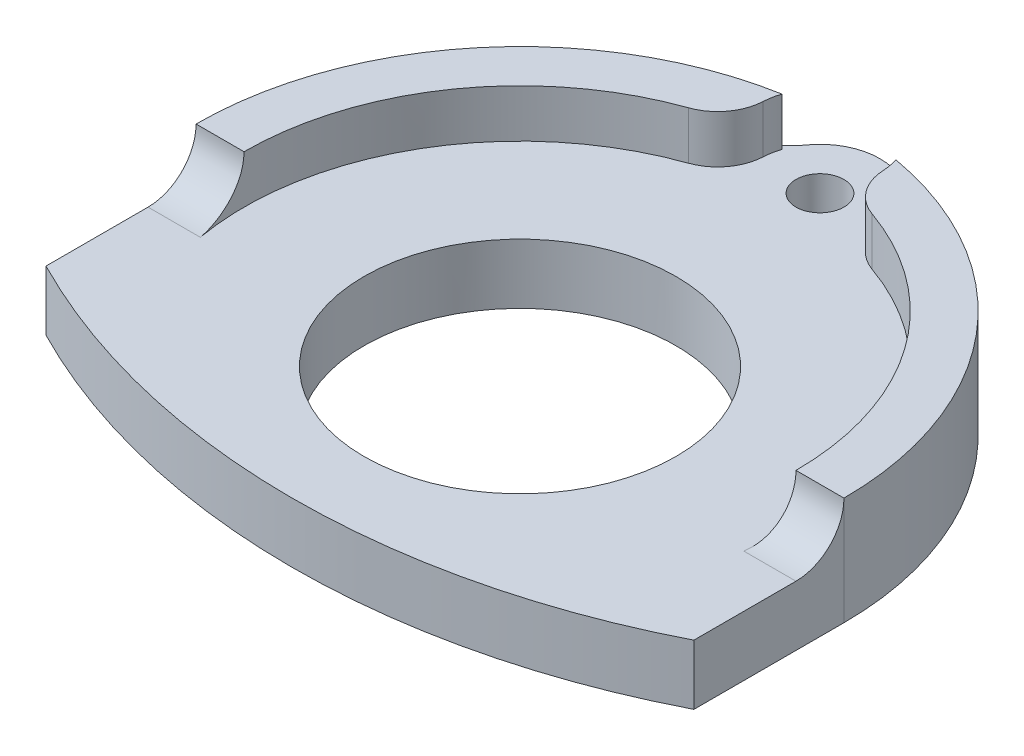
ISO-10303-21;
HEADER;
FILE_DESCRIPTION(('STEP AP214'),'2;1');
FILE_NAME('part.step','',(''),(''),'','','');
FILE_SCHEMA(('AUTOMOTIVE_DESIGN { 1 0 10303 214 1 1 1 1 }'));
ENDSEC;
DATA;
#1=APPLICATION_CONTEXT('core data for automotive mechanical design processes');
#2=APPLICATION_PROTOCOL_DEFINITION('international standard','automotive_design',2000,#1);
#3=PRODUCT_CONTEXT('',#1,'mechanical');
#4=PRODUCT('Part','Part','',(#3));
#5=PRODUCT_RELATED_PRODUCT_CATEGORY('part','',(#4));
#6=PRODUCT_DEFINITION_FORMATION('','',#4);
#7=PRODUCT_DEFINITION_CONTEXT('part definition',#1,'design');
#8=PRODUCT_DEFINITION('design','',#6,#7);
#9=PRODUCT_DEFINITION_SHAPE('','',#8);
#10=(LENGTH_UNIT() NAMED_UNIT(*) SI_UNIT(.MILLI.,.METRE.));
#11=(NAMED_UNIT(*) PLANE_ANGLE_UNIT() SI_UNIT($,.RADIAN.));
#12=(NAMED_UNIT(*) SI_UNIT($,.STERADIAN.) SOLID_ANGLE_UNIT());
#13=UNCERTAINTY_MEASURE_WITH_UNIT(LENGTH_MEASURE(1.E-05),#10,'distance_accuracy_value','');
#14=(GEOMETRIC_REPRESENTATION_CONTEXT(3) GLOBAL_UNCERTAINTY_ASSIGNED_CONTEXT((#13)) GLOBAL_UNIT_ASSIGNED_CONTEXT((#10,
#11,#12)) REPRESENTATION_CONTEXT('',''));
#15=CARTESIAN_POINT('',(0.,0.,0.));
#16=DIRECTION('',(0.,0.,1.));
#17=DIRECTION('',(1.,0.,0.));
#18=AXIS2_PLACEMENT_3D('',#15,#16,#17);
#19=CARTESIAN_POINT('',(0.,2.50000000000001,0.));
#20=DIRECTION('',(0.,-1.,0.));
#21=DIRECTION('',(0.,0.,-1.));
#22=AXIS2_PLACEMENT_3D('',#19,#20,#21);
#23=PLANE('',#22);
#24=CARTESIAN_POINT('',(0.,2.50000000000002,20.185));
#25=DIRECTION('',(0.,-1.,0.));
#26=DIRECTION('',(0.,0.,-1.));
#27=AXIS2_PLACEMENT_3D('',#24,#25,#26);
#28=CIRCLE('',#27,6.50000000000001);
#29=CARTESIAN_POINT('',(0.,2.50000000000001,13.685));
#30=VERTEX_POINT('',#29);
#31=EDGE_CURVE('E215',#30,#30,#28,.T.);
#32=ORIENTED_EDGE('',*,*,#31,.T.);
#33=EDGE_LOOP('',(#32));
#34=FACE_BOUND('',#33,.T.);
#35=CARTESIAN_POINT('',(0.,2.50000000000001,7.68500000000002));
#36=DIRECTION('',(0.,-1.,0.));
#37=DIRECTION('',(0.,0.,-1.));
#38=AXIS2_PLACEMENT_3D('',#35,#36,#37);
#39=CIRCLE('',#38,1.);
#40=CARTESIAN_POINT('',(0.,2.50000000000001,6.68500000000002));
#41=VERTEX_POINT('',#40);
#42=EDGE_CURVE('E237',#41,#41,#39,.T.);
#43=ORIENTED_EDGE('',*,*,#42,.T.);
#44=EDGE_LOOP('',(#43));
#45=FACE_BOUND('',#44,.T.);
#46=CARTESIAN_POINT('',(0.,2.50000000000002,20.185));
#47=DIRECTION('',(0.,-1.,0.));
#48=DIRECTION('',(0.,0.,1.));
#49=AXIS2_PLACEMENT_3D('',#46,#47,#48);
#50=CIRCLE('',#49,11.5);
#51=CARTESIAN_POINT('',(-11.3247516529061,2.50000000000002,22.1850000000001));
#52=VERTEX_POINT('',#51);
#53=CARTESIAN_POINT('',(-3.82832306316937,2.50000000000001,9.34092592592594));
#54=VERTEX_POINT('',#53);
#55=EDGE_CURVE('E193',#52,#54,#50,.T.);
#56=ORIENTED_EDGE('',*,*,#55,.F.);
#57=DIRECTION('',(1.,0.,0.));
#58=VECTOR('',#57,1.);
#59=CARTESIAN_POINT('',(-13.5000000000001,2.50000000000002,22.185));
#60=LINE('',#59,#58);
#61=CARTESIAN_POINT('',(-13.5,2.50000000000002,22.185));
#62=VERTEX_POINT('',#61);
#63=EDGE_CURVE('E282',#52,#62,#60,.F.);
#64=ORIENTED_EDGE('',*,*,#63,.T.);
#65=DIRECTION('',(0.,0.,-1.));
#66=VECTOR('',#65,1.);
#67=CARTESIAN_POINT('',(-13.5,2.50000000000002,26.4376478719269));
#68=LINE('',#67,#66);
#69=CARTESIAN_POINT('',(-13.5,2.50000000000002,26.4376478719269));
#70=VERTEX_POINT('',#69);
#71=EDGE_CURVE('E225',#70,#62,#68,.T.);
#72=ORIENTED_EDGE('',*,*,#71,.F.);
#73=CARTESIAN_POINT('',(0.,2.50000000000001,0.));
#74=DIRECTION('',(0.,-1.,0.));
#75=DIRECTION('',(0.,0.,-1.));
#76=AXIS2_PLACEMENT_3D('',#73,#74,#75);
#77=CIRCLE('',#76,29.685);
#78=CARTESIAN_POINT('',(13.5,2.50000000000002,26.4376478719269));
#79=VERTEX_POINT('',#78);
#80=EDGE_CURVE('E230',#79,#70,#77,.T.);
#81=ORIENTED_EDGE('',*,*,#80,.F.);
#82=DIRECTION('',(0.,0.,1.));
#83=VECTOR('',#82,1.);
#84=CARTESIAN_POINT('',(13.5,2.50000000000002,26.4376478719269));
#85=LINE('',#84,#83);
#86=CARTESIAN_POINT('',(13.5,2.50000000000002,22.185));
#87=VERTEX_POINT('',#86);
#88=EDGE_CURVE('E216',#87,#79,#85,.T.);
#89=ORIENTED_EDGE('',*,*,#88,.F.);
#90=DIRECTION('',(1.,0.,0.));
#91=VECTOR('',#90,1.);
#92=CARTESIAN_POINT('',(11.5,2.50000000000002,22.185));
#93=LINE('',#92,#91);
#94=CARTESIAN_POINT('',(11.3247516529061,2.50000000000002,22.185));
#95=VERTEX_POINT('',#94);
#96=EDGE_CURVE('E279',#87,#95,#93,.F.);
#97=ORIENTED_EDGE('',*,*,#96,.T.);
#98=CARTESIAN_POINT('',(0.,2.50000000000002,20.185));
#99=DIRECTION('',(0.,-1.,0.));
#100=DIRECTION('',(0.,0.,1.));
#101=AXIS2_PLACEMENT_3D('',#98,#99,#100);
#102=CIRCLE('',#101,11.5);
#103=CARTESIAN_POINT('',(3.82832306316937,2.50000000000001,9.34092592592595));
#104=VERTEX_POINT('',#103);
#105=EDGE_CURVE('E395',#104,#95,#102,.T.);
#106=ORIENTED_EDGE('',*,*,#105,.F.);
#107=CARTESIAN_POINT('',(4.49411837850317,2.50000000000001,7.45500000000002));
#108=DIRECTION('',(0.,1.,0.));
#109=DIRECTION('',(0.,0.,1.));
#110=AXIS2_PLACEMENT_3D('',#107,#108,#109);
#111=CIRCLE('',#110,2.);
#112=CARTESIAN_POINT('',(2.49673243250177,2.50000000000001,7.55722222222224));
#113=VERTEX_POINT('',#112);
#114=EDGE_CURVE('E176',#113,#104,#111,.T.);
#115=ORIENTED_EDGE('',*,*,#114,.F.);
#116=CARTESIAN_POINT('',(0.,2.50000000000001,7.68500000000002));
#117=DIRECTION('',(0.,-1.,0.));
#118=DIRECTION('',(0.,0.,1.));
#119=AXIS2_PLACEMENT_3D('',#116,#117,#118);
#120=CIRCLE('',#119,2.5);
#121=CARTESIAN_POINT('',(2.37189797419704,2.50000000000001,6.89500000000002));
#122=VERTEX_POINT('',#121);
#123=EDGE_CURVE('E172',#122,#113,#120,.T.);
#124=ORIENTED_EDGE('',*,*,#123,.F.);
#125=CARTESIAN_POINT('',(0.,2.50000000000002,20.185));
#126=DIRECTION('',(0.,-1.,0.));
#127=DIRECTION('',(0.,0.,-1.));
#128=AXIS2_PLACEMENT_3D('',#125,#126,#127);
#129=CIRCLE('',#128,13.5);
#130=CARTESIAN_POINT('',(3.22934120851282,2.50000000000001,7.07693548387099));
#131=VERTEX_POINT('',#130);
#132=EDGE_CURVE('E262',#131,#122,#129,.F.);
#133=ORIENTED_EDGE('',*,*,#132,.F.);
#134=CARTESIAN_POINT('',(3.70776212829249,2.50000000000001,5.13500000000002));
#135=DIRECTION('',(0.,-1.,0.));
#136=DIRECTION('',(0.,0.,-1.));
#137=AXIS2_PLACEMENT_3D('',#134,#135,#136);
#138=CIRCLE('',#137,2.);
#139=CARTESIAN_POINT('',(2.05986784905139,2.50000000000001,6.26833333333335));
#140=VERTEX_POINT('',#139);
#141=EDGE_CURVE('E284',#131,#140,#138,.T.);
#142=ORIENTED_EDGE('',*,*,#141,.T.);
#143=CARTESIAN_POINT('',(0.,2.50000000000001,7.68500000000002));
#144=DIRECTION('',(0.,-1.,0.));
#145=DIRECTION('',(0.,0.,-1.));
#146=AXIS2_PLACEMENT_3D('',#143,#144,#145);
#147=CIRCLE('',#146,2.5);
#148=CARTESIAN_POINT('',(-2.05986784905139,2.50000000000001,6.26833333333335));
#149=VERTEX_POINT('',#148);
#150=EDGE_CURVE('E220',#149,#140,#147,.T.);
#151=ORIENTED_EDGE('',*,*,#150,.F.);
#152=CARTESIAN_POINT('',(-3.70776212829249,2.50000000000001,5.13500000000002));
#153=DIRECTION('',(0.,-1.,0.));
#154=DIRECTION('',(0.,0.,-1.));
#155=AXIS2_PLACEMENT_3D('',#152,#153,#154);
#156=CIRCLE('',#155,2.);
#157=CARTESIAN_POINT('',(-3.22934120851282,2.50000000000001,7.07693548387099));
#158=VERTEX_POINT('',#157);
#159=EDGE_CURVE('E288',#149,#158,#156,.T.);
#160=ORIENTED_EDGE('',*,*,#159,.T.);
#161=CARTESIAN_POINT('',(0.,2.50000000000002,20.185));
#162=DIRECTION('',(0.,-1.,0.));
#163=DIRECTION('',(0.,0.,-1.));
#164=AXIS2_PLACEMENT_3D('',#161,#162,#163);
#165=CIRCLE('',#164,13.5);
#166=CARTESIAN_POINT('',(-2.37189797419704,2.50000000000001,6.89500000000002));
#167=VERTEX_POINT('',#166);
#168=EDGE_CURVE('E276',#167,#158,#165,.F.);
#169=ORIENTED_EDGE('',*,*,#168,.F.);
#170=CARTESIAN_POINT('',(0.,2.50000000000001,7.68500000000002));
#171=DIRECTION('',(0.,-1.,0.));
#172=DIRECTION('',(0.,0.,1.));
#173=AXIS2_PLACEMENT_3D('',#170,#171,#172);
#174=CIRCLE('',#173,2.5);
#175=CARTESIAN_POINT('',(-2.49673243250177,2.50000000000001,7.55722222222224));
#176=VERTEX_POINT('',#175);
#177=EDGE_CURVE('E182',#176,#167,#174,.T.);
#178=ORIENTED_EDGE('',*,*,#177,.F.);
#179=CARTESIAN_POINT('',(-4.49411837850317,2.50000000000001,7.45500000000002));
#180=DIRECTION('',(0.,1.,0.));
#181=DIRECTION('',(0.,0.,1.));
#182=AXIS2_PLACEMENT_3D('',#179,#180,#181);
#183=CIRCLE('',#182,2.);
#184=EDGE_CURVE('E178',#54,#176,#183,.T.);
#185=ORIENTED_EDGE('',*,*,#184,.F.);
#186=EDGE_LOOP('',(#56,#64,#72,#81,#89,#97,#106,#115,#124,#133,#142,#151,#160,#169,#178,#185));
#187=FACE_BOUND('',#186,.T.);
#188=ADVANCED_FACE('F33',(#34,#45,#187),#23,.F.);
#189=CARTESIAN_POINT('',(0.,-36.4588809482683,0.));
#190=DIRECTION('',(0.,1.,0.));
#191=DIRECTION('',(0.,0.,1.));
#192=AXIS2_PLACEMENT_3D('',#189,#190,#191);
#193=CYLINDRICAL_SURFACE('',#192,29.685);
#194=DIRECTION('',(0.,1.,0.));
#195=VECTOR('',#194,1.);
#196=CARTESIAN_POINT('',(-13.5,-36.4588809482683,26.4376478719269));
#197=LINE('',#196,#195);
#198=CARTESIAN_POINT('',(-13.5,0.,26.4376478719269));
#199=VERTEX_POINT('',#198);
#200=EDGE_CURVE('E229',#199,#70,#197,.T.);
#201=ORIENTED_EDGE('',*,*,#200,.F.);
#202=CARTESIAN_POINT('',(0.,0.,0.));
#203=DIRECTION('',(0.,1.,0.));
#204=DIRECTION('',(0.,0.,1.));
#205=AXIS2_PLACEMENT_3D('',#202,#203,#204);
#206=CIRCLE('',#205,29.685);
#207=CARTESIAN_POINT('',(13.5,0.,26.4376478719269));
#208=VERTEX_POINT('',#207);
#209=EDGE_CURVE('E240',#199,#208,#206,.T.);
#210=ORIENTED_EDGE('',*,*,#209,.T.);
#211=DIRECTION('',(0.,1.,0.));
#212=VECTOR('',#211,1.);
#213=CARTESIAN_POINT('',(13.5,-36.4588809482683,26.4376478719269));
#214=LINE('',#213,#212);
#215=EDGE_CURVE('E234',#208,#79,#214,.T.);
#216=ORIENTED_EDGE('',*,*,#215,.T.);
#217=ORIENTED_EDGE('',*,*,#80,.T.);
#218=EDGE_LOOP('',(#201,#210,#216,#217));
#219=FACE_BOUND('',#218,.T.);
#220=ADVANCED_FACE('F332',(#219),#193,.T.);
#221=CARTESIAN_POINT('',(-13.5,-36.4588809482683,26.4376478719269));
#222=DIRECTION('',(1.,0.,0.));
#223=DIRECTION('',(0.,0.,-1.));
#224=AXIS2_PLACEMENT_3D('',#221,#222,#223);
#225=PLANE('',#224);
#226=DIRECTION('',(0.,1.,0.));
#227=VECTOR('',#226,1.);
#228=CARTESIAN_POINT('',(-13.5,-36.4588809482683,20.185));
#229=LINE('',#228,#227);
#230=CARTESIAN_POINT('',(-13.5,0.,20.185));
#231=VERTEX_POINT('',#230);
#232=CARTESIAN_POINT('',(-13.5,4.50000000000002,20.185));
#233=VERTEX_POINT('',#232);
#234=EDGE_CURVE('E55',#231,#233,#229,.T.);
#235=ORIENTED_EDGE('',*,*,#234,.F.);
#236=DIRECTION('',(0.,0.,1.));
#237=VECTOR('',#236,1.);
#238=CARTESIAN_POINT('',(-13.5,0.,26.4376478719269));
#239=LINE('',#238,#237);
#240=EDGE_CURVE('E233',#231,#199,#239,.T.);
#241=ORIENTED_EDGE('',*,*,#240,.T.);
#242=ORIENTED_EDGE('',*,*,#200,.T.);
#243=ORIENTED_EDGE('',*,*,#71,.T.);
#244=CARTESIAN_POINT('',(-13.5,4.50000000000002,22.185));
#245=DIRECTION('',(1.,0.,0.));
#246=DIRECTION('',(0.,0.,-1.));
#247=AXIS2_PLACEMENT_3D('',#244,#245,#246);
#248=CIRCLE('',#247,2.);
#249=EDGE_CURVE('E300',#62,#233,#248,.T.);
#250=ORIENTED_EDGE('',*,*,#249,.T.);
#251=EDGE_LOOP('',(#235,#241,#242,#243,#250));
#252=FACE_BOUND('',#251,.T.);
#253=ADVANCED_FACE('F335',(#252),#225,.F.);
#254=CARTESIAN_POINT('',(0.,-36.4588809482683,20.185));
#255=DIRECTION('',(0.,1.,0.));
#256=DIRECTION('',(0.,0.,1.));
#257=AXIS2_PLACEMENT_3D('',#254,#255,#256);
#258=CYLINDRICAL_SURFACE('',#257,13.5);
#259=DIRECTION('',(0.,-1.,0.));
#260=VECTOR('',#259,1.);
#261=CARTESIAN_POINT('',(-2.37189797419704,4.50000000000001,6.89500000000002));
#262=LINE('',#261,#260);
#263=CARTESIAN_POINT('',(-2.37189797419704,4.50000000000001,6.89500000000002));
#264=VERTEX_POINT('',#263);
#265=EDGE_CURVE('E209',#264,#167,#262,.T.);
#266=ORIENTED_EDGE('',*,*,#265,.T.);
#267=ORIENTED_EDGE('',*,*,#168,.T.);
#268=DIRECTION('',(0.,1.,0.));
#269=VECTOR('',#268,1.);
#270=CARTESIAN_POINT('',(-3.22934120851282,-36.4588809482683,7.07693548387101));
#271=LINE('',#270,#269);
#272=CARTESIAN_POINT('',(-3.22934120851282,0.,7.07693548387099));
#273=VERTEX_POINT('',#272);
#274=EDGE_CURVE('E274',#158,#273,#271,.F.);
#275=ORIENTED_EDGE('',*,*,#274,.T.);
#276=CARTESIAN_POINT('',(0.,0.,20.185));
#277=DIRECTION('',(0.,1.,0.));
#278=DIRECTION('',(0.,0.,1.));
#279=AXIS2_PLACEMENT_3D('',#276,#277,#278);
#280=CIRCLE('',#279,13.5);
#281=EDGE_CURVE('E228',#273,#231,#280,.T.);
#282=ORIENTED_EDGE('',*,*,#281,.T.);
#283=ORIENTED_EDGE('',*,*,#234,.T.);
#284=CARTESIAN_POINT('',(0.,4.50000000000002,20.185));
#285=DIRECTION('',(0.,1.,0.));
#286=DIRECTION('',(0.,0.,1.));
#287=AXIS2_PLACEMENT_3D('',#284,#285,#286);
#288=CIRCLE('',#287,13.5);
#289=EDGE_CURVE('E195',#264,#233,#288,.T.);
#290=ORIENTED_EDGE('',*,*,#289,.F.);
#291=EDGE_LOOP('',(#266,#267,#275,#282,#283,#290));
#292=FACE_BOUND('',#291,.T.);
#293=ADVANCED_FACE('F339',(#292),#258,.T.);
#294=CARTESIAN_POINT('',(0.,-36.4588809482683,7.68500000000004));
#295=DIRECTION('',(0.,1.,0.));
#296=DIRECTION('',(0.,0.,1.));
#297=AXIS2_PLACEMENT_3D('',#294,#295,#296);
#298=CYLINDRICAL_SURFACE('',#297,2.5);
#299=ORIENTED_EDGE('',*,*,#150,.T.);
#300=DIRECTION('',(0.,1.,0.));
#301=VECTOR('',#300,1.);
#302=CARTESIAN_POINT('',(2.05986784905139,-36.4588809482683,6.26833333333337));
#303=LINE('',#302,#301);
#304=CARTESIAN_POINT('',(2.05986784905139,0.,6.26833333333335));
#305=VERTEX_POINT('',#304);
#306=EDGE_CURVE('E272',#140,#305,#303,.F.);
#307=ORIENTED_EDGE('',*,*,#306,.T.);
#308=CARTESIAN_POINT('',(0.,0.,7.68500000000002));
#309=DIRECTION('',(0.,1.,0.));
#310=DIRECTION('',(0.,0.,1.));
#311=AXIS2_PLACEMENT_3D('',#308,#309,#310);
#312=CIRCLE('',#311,2.5);
#313=CARTESIAN_POINT('',(-2.05986784905139,0.,6.26833333333335));
#314=VERTEX_POINT('',#313);
#315=EDGE_CURVE('E224',#305,#314,#312,.T.);
#316=ORIENTED_EDGE('',*,*,#315,.T.);
#317=DIRECTION('',(0.,1.,0.));
#318=VECTOR('',#317,1.);
#319=CARTESIAN_POINT('',(-2.05986784905139,-36.4588809482683,6.26833333333337));
#320=LINE('',#319,#318);
#321=EDGE_CURVE('E269',#314,#149,#320,.T.);
#322=ORIENTED_EDGE('',*,*,#321,.T.);
#323=EDGE_LOOP('',(#299,#307,#316,#322));
#324=FACE_BOUND('',#323,.T.);
#325=ADVANCED_FACE('F343',(#324),#298,.T.);
#326=CARTESIAN_POINT('',(0.,-36.4588809482683,20.185));
#327=DIRECTION('',(0.,1.,0.));
#328=DIRECTION('',(0.,0.,1.));
#329=AXIS2_PLACEMENT_3D('',#326,#327,#328);
#330=CYLINDRICAL_SURFACE('',#329,13.5);
#331=CARTESIAN_POINT('',(0.,0.,20.185));
#332=DIRECTION('',(0.,1.,0.));
#333=DIRECTION('',(0.,0.,1.));
#334=AXIS2_PLACEMENT_3D('',#331,#332,#333);
#335=CIRCLE('',#334,13.5);
#336=CARTESIAN_POINT('',(13.5,0.,20.185));
#337=VERTEX_POINT('',#336);
#338=CARTESIAN_POINT('',(3.22934120851282,0.,7.07693548387099));
#339=VERTEX_POINT('',#338);
#340=EDGE_CURVE('E223',#337,#339,#335,.T.);
#341=ORIENTED_EDGE('',*,*,#340,.T.);
#342=DIRECTION('',(0.,1.,0.));
#343=VECTOR('',#342,1.);
#344=CARTESIAN_POINT('',(3.22934120851282,-36.4588809482683,7.07693548387101));
#345=LINE('',#344,#343);
#346=EDGE_CURVE('E266',#339,#131,#345,.T.);
#347=ORIENTED_EDGE('',*,*,#346,.T.);
#348=ORIENTED_EDGE('',*,*,#132,.T.);
#349=DIRECTION('',(0.,-1.,0.));
#350=VECTOR('',#349,1.);
#351=CARTESIAN_POINT('',(2.37189797419704,4.50000000000001,6.89500000000002));
#352=LINE('',#351,#350);
#353=CARTESIAN_POINT('',(2.37189797419704,4.50000000000001,6.89500000000002));
#354=VERTEX_POINT('',#353);
#355=EDGE_CURVE('E179',#354,#122,#352,.T.);
#356=ORIENTED_EDGE('',*,*,#355,.F.);
#357=CARTESIAN_POINT('',(0.,4.50000000000002,20.185));
#358=DIRECTION('',(0.,1.,0.));
#359=DIRECTION('',(0.,0.,1.));
#360=AXIS2_PLACEMENT_3D('',#357,#358,#359);
#361=CIRCLE('',#360,13.5);
#362=CARTESIAN_POINT('',(13.5,4.50000000000002,20.185));
#363=VERTEX_POINT('',#362);
#364=EDGE_CURVE('E389',#363,#354,#361,.T.);
#365=ORIENTED_EDGE('',*,*,#364,.F.);
#366=DIRECTION('',(0.,1.,0.));
#367=VECTOR('',#366,1.);
#368=CARTESIAN_POINT('',(13.5,-36.4588809482683,20.185));
#369=LINE('',#368,#367);
#370=EDGE_CURVE('E219',#337,#363,#369,.T.);
#371=ORIENTED_EDGE('',*,*,#370,.F.);
#372=EDGE_LOOP('',(#341,#347,#348,#356,#365,#371));
#373=FACE_BOUND('',#372,.T.);
#374=ADVANCED_FACE('F346',(#373),#330,.T.);
#375=CARTESIAN_POINT('',(13.5,-36.4588809482683,26.4376478719269));
#376=DIRECTION('',(-1.,0.,0.));
#377=DIRECTION('',(0.,0.,1.));
#378=AXIS2_PLACEMENT_3D('',#375,#376,#377);
#379=PLANE('',#378);
#380=ORIENTED_EDGE('',*,*,#215,.F.);
#381=DIRECTION('',(0.,0.,-1.));
#382=VECTOR('',#381,1.);
#383=CARTESIAN_POINT('',(13.5,0.,26.4376478719269));
#384=LINE('',#383,#382);
#385=EDGE_CURVE('E245',#208,#337,#384,.T.);
#386=ORIENTED_EDGE('',*,*,#385,.T.);
#387=ORIENTED_EDGE('',*,*,#370,.T.);
#388=CARTESIAN_POINT('',(13.5,4.50000000000002,22.185));
#389=DIRECTION('',(-1.,0.,0.));
#390=DIRECTION('',(0.,0.,1.));
#391=AXIS2_PLACEMENT_3D('',#388,#389,#390);
#392=CIRCLE('',#391,2.);
#393=EDGE_CURVE('E48',#363,#87,#392,.T.);
#394=ORIENTED_EDGE('',*,*,#393,.T.);
#395=ORIENTED_EDGE('',*,*,#88,.T.);
#396=EDGE_LOOP('',(#380,#386,#387,#394,#395));
#397=FACE_BOUND('',#396,.T.);
#398=ADVANCED_FACE('F330',(#397),#379,.F.);
#399=CARTESIAN_POINT('',(0.,-36.4588809482683,20.185));
#400=DIRECTION('',(0.,1.,0.));
#401=DIRECTION('',(0.,0.,1.));
#402=AXIS2_PLACEMENT_3D('',#399,#400,#401);
#403=CYLINDRICAL_SURFACE('',#402,6.50000000000001);
#404=CARTESIAN_POINT('',(0.,0.,20.185));
#405=DIRECTION('',(0.,1.,0.));
#406=DIRECTION('',(0.,0.,1.));
#407=AXIS2_PLACEMENT_3D('',#404,#405,#406);
#408=CIRCLE('',#407,6.50000000000001);
#409=CARTESIAN_POINT('',(0.,0.,26.685));
#410=VERTEX_POINT('',#409);
#411=EDGE_CURVE('E259',#410,#410,#408,.T.);
#412=ORIENTED_EDGE('',*,*,#411,.F.);
#413=EDGE_LOOP('',(#412));
#414=FACE_BOUND('',#413,.T.);
#415=ORIENTED_EDGE('',*,*,#31,.F.);
#416=EDGE_LOOP('',(#415));
#417=FACE_BOUND('',#416,.T.);
#418=ADVANCED_FACE('F326',(#414,#417),#403,.F.);
#419=CARTESIAN_POINT('',(0.,-36.4588809482683,7.68500000000004));
#420=DIRECTION('',(0.,1.,0.));
#421=DIRECTION('',(0.,0.,1.));
#422=AXIS2_PLACEMENT_3D('',#419,#420,#421);
#423=CYLINDRICAL_SURFACE('',#422,1.);
#424=CARTESIAN_POINT('',(0.,0.,7.68500000000002));
#425=DIRECTION('',(0.,1.,0.));
#426=DIRECTION('',(0.,0.,1.));
#427=AXIS2_PLACEMENT_3D('',#424,#425,#426);
#428=CIRCLE('',#427,1.);
#429=CARTESIAN_POINT('',(0.,0.,8.68500000000002));
#430=VERTEX_POINT('',#429);
#431=EDGE_CURVE('E218',#430,#430,#428,.T.);
#432=ORIENTED_EDGE('',*,*,#431,.F.);
#433=EDGE_LOOP('',(#432));
#434=FACE_BOUND('',#433,.T.);
#435=ORIENTED_EDGE('',*,*,#42,.F.);
#436=EDGE_LOOP('',(#435));
#437=FACE_BOUND('',#436,.T.);
#438=ADVANCED_FACE('F322',(#434,#437),#423,.F.);
#439=CARTESIAN_POINT('',(0.,0.,0.));
#440=DIRECTION('',(0.,1.,0.));
#441=DIRECTION('',(0.,0.,1.));
#442=AXIS2_PLACEMENT_3D('',#439,#440,#441);
#443=PLANE('',#442);
#444=ORIENTED_EDGE('',*,*,#431,.T.);
#445=EDGE_LOOP('',(#444));
#446=FACE_BOUND('',#445,.T.);
#447=ORIENTED_EDGE('',*,*,#411,.T.);
#448=EDGE_LOOP('',(#447));
#449=FACE_BOUND('',#448,.T.);
#450=ORIENTED_EDGE('',*,*,#240,.F.);
#451=ORIENTED_EDGE('',*,*,#281,.F.);
#452=CARTESIAN_POINT('',(-3.70776212829249,0.,5.13500000000002));
#453=DIRECTION('',(0.,1.,0.));
#454=DIRECTION('',(0.,0.,1.));
#455=AXIS2_PLACEMENT_3D('',#452,#453,#454);
#456=CIRCLE('',#455,2.);
#457=EDGE_CURVE('E290',#273,#314,#456,.T.);
#458=ORIENTED_EDGE('',*,*,#457,.T.);
#459=ORIENTED_EDGE('',*,*,#315,.F.);
#460=CARTESIAN_POINT('',(3.70776212829249,0.,5.13500000000002));
#461=DIRECTION('',(0.,1.,0.));
#462=DIRECTION('',(0.,0.,1.));
#463=AXIS2_PLACEMENT_3D('',#460,#461,#462);
#464=CIRCLE('',#463,2.);
#465=EDGE_CURVE('E286',#305,#339,#464,.T.);
#466=ORIENTED_EDGE('',*,*,#465,.T.);
#467=ORIENTED_EDGE('',*,*,#340,.F.);
#468=ORIENTED_EDGE('',*,*,#385,.F.);
#469=ORIENTED_EDGE('',*,*,#209,.F.);
#470=EDGE_LOOP('',(#450,#451,#458,#459,#466,#467,#468,#469));
#471=FACE_BOUND('',#470,.T.);
#472=ADVANCED_FACE('F318',(#446,#449,#471),#443,.F.);
#473=CARTESIAN_POINT('',(-4.49411837850317,4.50000000000001,7.45500000000002));
#474=DIRECTION('',(0.,-1.,0.));
#475=DIRECTION('',(0.,0.,-1.));
#476=AXIS2_PLACEMENT_3D('',#473,#474,#475);
#477=CYLINDRICAL_SURFACE('',#476,2.);
#478=ORIENTED_EDGE('',*,*,#184,.T.);
#479=DIRECTION('',(0.,-1.,0.));
#480=VECTOR('',#479,1.);
#481=CARTESIAN_POINT('',(-2.49673243250177,4.50000000000001,7.55722222222224));
#482=LINE('',#481,#480);
#483=CARTESIAN_POINT('',(-2.49673243250177,4.50000000000001,7.55722222222224));
#484=VERTEX_POINT('',#483);
#485=EDGE_CURVE('E212',#484,#176,#482,.T.);
#486=ORIENTED_EDGE('',*,*,#485,.F.);
#487=CARTESIAN_POINT('',(-4.49411837850317,4.50000000000001,7.45500000000002));
#488=DIRECTION('',(0.,1.,0.));
#489=DIRECTION('',(0.,0.,1.));
#490=AXIS2_PLACEMENT_3D('',#487,#488,#489);
#491=CIRCLE('',#490,2.);
#492=CARTESIAN_POINT('',(-3.82832306316937,4.50000000000001,9.34092592592594));
#493=VERTEX_POINT('',#492);
#494=EDGE_CURVE('E189',#493,#484,#491,.T.);
#495=ORIENTED_EDGE('',*,*,#494,.F.);
#496=DIRECTION('',(0.,-1.,0.));
#497=VECTOR('',#496,1.);
#498=CARTESIAN_POINT('',(-3.82832306316937,4.50000000000001,9.34092592592594));
#499=LINE('',#498,#497);
#500=EDGE_CURVE('E201',#493,#54,#499,.T.);
#501=ORIENTED_EDGE('',*,*,#500,.T.);
#502=EDGE_LOOP('',(#478,#486,#495,#501));
#503=FACE_BOUND('',#502,.T.);
#504=ADVANCED_FACE('F321',(#503),#477,.T.);
#505=CARTESIAN_POINT('',(0.,4.50000000000001,7.68500000000002));
#506=DIRECTION('',(0.,-1.,0.));
#507=DIRECTION('',(0.,0.,-1.));
#508=AXIS2_PLACEMENT_3D('',#505,#506,#507);
#509=CYLINDRICAL_SURFACE('',#508,2.5);
#510=ORIENTED_EDGE('',*,*,#177,.T.);
#511=ORIENTED_EDGE('',*,*,#265,.F.);
#512=CARTESIAN_POINT('',(0.,4.50000000000001,7.68500000000002));
#513=DIRECTION('',(0.,-1.,0.));
#514=DIRECTION('',(0.,0.,1.));
#515=AXIS2_PLACEMENT_3D('',#512,#513,#514);
#516=CIRCLE('',#515,2.5);
#517=EDGE_CURVE('E192',#484,#264,#516,.T.);
#518=ORIENTED_EDGE('',*,*,#517,.F.);
#519=ORIENTED_EDGE('',*,*,#485,.T.);
#520=EDGE_LOOP('',(#510,#511,#518,#519));
#521=FACE_BOUND('',#520,.T.);
#522=ADVANCED_FACE('F358',(#521),#509,.F.);
#523=CARTESIAN_POINT('',(0.,4.50000000000002,20.185));
#524=DIRECTION('',(0.,-1.,0.));
#525=DIRECTION('',(0.,0.,-1.));
#526=AXIS2_PLACEMENT_3D('',#523,#524,#525);
#527=CYLINDRICAL_SURFACE('',#526,11.5);
#528=ORIENTED_EDGE('',*,*,#55,.T.);
#529=ORIENTED_EDGE('',*,*,#500,.F.);
#530=CARTESIAN_POINT('',(0.,4.50000000000002,20.185));
#531=DIRECTION('',(0.,-1.,0.));
#532=DIRECTION('',(0.,0.,1.));
#533=AXIS2_PLACEMENT_3D('',#530,#531,#532);
#534=CIRCLE('',#533,11.5);
#535=CARTESIAN_POINT('',(-11.5,4.50000000000002,20.1850000000001));
#536=VERTEX_POINT('',#535);
#537=EDGE_CURVE('E200',#536,#493,#534,.T.);
#538=ORIENTED_EDGE('',*,*,#537,.F.);
#539=CARTESIAN_POINT('',(-11.5,4.50000000000002,20.1850000000001));
#540=CARTESIAN_POINT('',(-11.4999976236755,4.44374733309184,20.1850003763513));
#541=CARTESIAN_POINT('',(-11.5000002671938,4.38752161076206,20.1873747605939));
#542=CARTESIAN_POINT('',(-11.4999953359062,4.27547219969168,20.1968471688284));
#543=CARTESIAN_POINT('',(-11.4999877615774,4.21964849230176,20.2039449722573));
#544=CARTESIAN_POINT('',(-11.4999194022778,4.05347174240441,20.2322571148869));
#545=CARTESIAN_POINT('',(-11.4998131026205,3.94423123685088,20.2604903665561));
#546=CARTESIAN_POINT('',(-11.4990825919171,3.73204102943312,20.334891121923));
#547=CARTESIAN_POINT('',(-11.4984581235037,3.62909448097634,20.3810675316752));
#548=CARTESIAN_POINT('',(-11.4960824580623,3.43242301700089,20.490034700092));
#549=CARTESIAN_POINT('',(-11.4943314543284,3.33869652265971,20.5528226074215));
#550=CARTESIAN_POINT('',(-11.4889827068319,3.16325488953125,20.6931170112498));
#551=CARTESIAN_POINT('',(-11.4853873158656,3.081524618162,20.7706046768014));
#552=CARTESIAN_POINT('',(-11.4756203669828,2.93225717149507,20.9380984965053));
#553=CARTESIAN_POINT('',(-11.4694486310034,2.86472097769983,21.0281055156402));
#554=CARTESIAN_POINT('',(-11.4539512885931,2.7460656058967,21.2174574543701));
#555=CARTESIAN_POINT('',(-11.4446419638078,2.69486427986544,21.316752293595));
#556=CARTESIAN_POINT('',(-11.422466727138,2.60977998355569,21.5221219798795));
#557=CARTESIAN_POINT('',(-11.4096021603553,2.57589047725225,21.6281942510978));
#558=CARTESIAN_POINT('',(-11.3848716397311,2.53402776374608,21.8098885220371));
#559=CARTESIAN_POINT('',(-11.3739680647772,2.52125331619938,21.884575005238));
#560=CARTESIAN_POINT('',(-11.3505504425739,2.5042394277807,22.034545791612));
#561=CARTESIAN_POINT('',(-11.3380389031113,2.49998686398976,22.1098289961092));
#562=CARTESIAN_POINT('',(-11.3247516529061,2.50000000000002,22.1850000000001));
#563=B_SPLINE_CURVE_WITH_KNOTS('',3,(#539,#540,#541,#542,#543,#544,#545,#546,#547,#548,#549,
#550,#551,#552,#553,#554,#555,#556,#557,#558,#559,#560,#561,#562),.UNSPECIFIED.,.F.,.F.,(4,2,2,
2,2,2,2,2,2,2,2,4),(0.,0.168654383720686,0.337300892571235,0.674055343452161,1.01097715575047,
1.34784117347518,1.68427653462033,2.0207351521947,2.35547402584557,2.69008642627285,
2.9192744825752,3.14810933826064),.UNSPECIFIED.);
#564=EDGE_CURVE('E292',#536,#52,#563,.T.);
#565=ORIENTED_EDGE('',*,*,#564,.T.);
#566=EDGE_LOOP('',(#528,#529,#538,#565));
#567=FACE_BOUND('',#566,.T.);
#568=ADVANCED_FACE('F301',(#567),#527,.F.);
#569=CARTESIAN_POINT('',(-4.49411837850317,4.50000000000001,7.45500000000002));
#570=DIRECTION('',(0.,1.,0.));
#571=DIRECTION('',(0.,0.,1.));
#572=AXIS2_PLACEMENT_3D('',#569,#570,#571);
#573=PLANE('',#572);
#574=ORIENTED_EDGE('',*,*,#494,.T.);
#575=ORIENTED_EDGE('',*,*,#517,.T.);
#576=ORIENTED_EDGE('',*,*,#289,.T.);
#577=DIRECTION('',(1.,0.,0.));
#578=VECTOR('',#577,1.);
#579=CARTESIAN_POINT('',(-13.5,4.50000000000002,20.185));
#580=LINE('',#579,#578);
#581=EDGE_CURVE('E197',#233,#536,#580,.T.);
#582=ORIENTED_EDGE('',*,*,#581,.T.);
#583=ORIENTED_EDGE('',*,*,#537,.T.);
#584=EDGE_LOOP('',(#574,#575,#576,#582,#583));
#585=FACE_BOUND('',#584,.T.);
#586=ADVANCED_FACE('F365',(#585),#573,.T.);
#587=CARTESIAN_POINT('',(4.49411837850317,4.50000000000001,7.45500000000002));
#588=DIRECTION('',(0.,-1.,0.));
#589=DIRECTION('',(0.,0.,-1.));
#590=AXIS2_PLACEMENT_3D('',#587,#588,#589);
#591=CYLINDRICAL_SURFACE('',#590,2.);
#592=ORIENTED_EDGE('',*,*,#114,.T.);
#593=DIRECTION('',(0.,-1.,0.));
#594=VECTOR('',#593,1.);
#595=CARTESIAN_POINT('',(3.82832306316937,4.50000000000001,9.34092592592594));
#596=LINE('',#595,#594);
#597=CARTESIAN_POINT('',(3.82832306316937,4.50000000000001,9.34092592592594));
#598=VERTEX_POINT('',#597);
#599=EDGE_CURVE('E156',#598,#104,#596,.T.);
#600=ORIENTED_EDGE('',*,*,#599,.F.);
#601=CARTESIAN_POINT('',(4.49411837850317,4.50000000000001,7.45500000000002));
#602=DIRECTION('',(0.,1.,0.));
#603=DIRECTION('',(0.,0.,1.));
#604=AXIS2_PLACEMENT_3D('',#601,#602,#603);
#605=CIRCLE('',#604,2.);
#606=CARTESIAN_POINT('',(2.49673243250177,4.50000000000001,7.55722222222224));
#607=VERTEX_POINT('',#606);
#608=EDGE_CURVE('E163',#607,#598,#605,.T.);
#609=ORIENTED_EDGE('',*,*,#608,.F.);
#610=DIRECTION('',(0.,-1.,0.));
#611=VECTOR('',#610,1.);
#612=CARTESIAN_POINT('',(2.49673243250177,4.50000000000001,7.55722222222224));
#613=LINE('',#612,#611);
#614=EDGE_CURVE('E185',#607,#113,#613,.T.);
#615=ORIENTED_EDGE('',*,*,#614,.T.);
#616=EDGE_LOOP('',(#592,#600,#609,#615));
#617=FACE_BOUND('',#616,.T.);
#618=ADVANCED_FACE('F174',(#617),#591,.T.);
#619=CARTESIAN_POINT('',(0.,4.50000000000002,20.185));
#620=DIRECTION('',(0.,-1.,0.));
#621=DIRECTION('',(0.,0.,-1.));
#622=AXIS2_PLACEMENT_3D('',#619,#620,#621);
#623=CYLINDRICAL_SURFACE('',#622,11.5);
#624=ORIENTED_EDGE('',*,*,#105,.T.);
#625=CARTESIAN_POINT('',(11.3247516529061,2.50000000000002,22.185));
#626=CARTESIAN_POINT('',(11.3345256876722,2.50000034861686,22.1296682330991));
#627=CARTESIAN_POINT('',(11.3438851500825,2.50229784388866,22.074288020873));
#628=CARTESIAN_POINT('',(11.3617387671699,2.51149921610737,21.9637690299018));
#629=CARTESIAN_POINT('',(11.3702328793566,2.51840331912261,21.9086302631393));
#630=CARTESIAN_POINT('',(11.3943382751175,2.54601666335144,21.7442506303362));
#631=CARTESIAN_POINT('',(11.4086011241677,2.5736268907632,21.6358842616591));
#632=CARTESIAN_POINT('',(11.4334645426677,2.64671490964463,21.4248472644601));
#633=CARTESIAN_POINT('',(11.4440616006098,2.69220974439487,21.3221821758392));
#634=CARTESIAN_POINT('',(11.4618847040925,2.79987201123031,21.1257071100697));
#635=CARTESIAN_POINT('',(11.4691118651983,2.86203391512809,21.0318942107213));
#636=CARTESIAN_POINT('',(11.480706481735,3.00074573296844,20.8566043956963));
#637=CARTESIAN_POINT('',(11.4850959389269,3.07717887925883,20.7750364297542));
#638=CARTESIAN_POINT('',(11.4917964887819,3.24262250955703,20.6256984415671));
#639=CARTESIAN_POINT('',(11.4941070525969,3.3316361872561,20.5579319336537));
#640=CARTESIAN_POINT('',(11.4973756333958,3.520037703754,20.4379466821001));
#641=CARTESIAN_POINT('',(11.4983289053176,3.61946063945735,20.3857829849508));
#642=CARTESIAN_POINT('',(11.4995194315469,3.82560795627479,20.2988149553636));
#643=CARTESIAN_POINT('',(11.499757052482,3.93232857012432,20.2640017419164));
#644=CARTESIAN_POINT('',(11.4999586030558,4.11631418542567,20.2206275126483));
#645=CARTESIAN_POINT('',(11.499984433101,4.19248597410976,20.2072778934033));
#646=CARTESIAN_POINT('',(11.5000000246059,4.34576164424876,20.1894634036935));
#647=CARTESIAN_POINT('',(11.4999898324985,4.42286419819254,20.1849871070267));
#648=CARTESIAN_POINT('',(11.5,4.50000000000002,20.185));
#649=B_SPLINE_CURVE_WITH_KNOTS('',3,(#625,#626,#627,#628,#629,#630,#631,#632,#633,#634,#635,
#636,#637,#638,#639,#640,#641,#642,#643,#644,#645,#646,#647,#648),.UNSPECIFIED.,.F.,.F.,(4,2,2,
2,2,2,2,2,2,2,2,4),(0.,0.168466723413755,0.336941714905659,0.673403949643126,1.01018759907924,
1.34685968091524,1.68088907971363,2.01500342797165,2.35028298838724,2.68539075608141,
2.91690244341344,3.14811581834515),.UNSPECIFIED.);
#650=CARTESIAN_POINT('',(11.5,4.50000000000002,20.185));
#651=VERTEX_POINT('',#650);
#652=EDGE_CURVE('E11',#95,#651,#649,.T.);
#653=ORIENTED_EDGE('',*,*,#652,.T.);
#654=CARTESIAN_POINT('',(0.,4.50000000000002,20.185));
#655=DIRECTION('',(0.,-1.,0.));
#656=DIRECTION('',(0.,0.,1.));
#657=AXIS2_PLACEMENT_3D('',#654,#655,#656);
#658=CIRCLE('',#657,11.5);
#659=EDGE_CURVE('E152',#598,#651,#658,.T.);
#660=ORIENTED_EDGE('',*,*,#659,.F.);
#661=ORIENTED_EDGE('',*,*,#599,.T.);
#662=EDGE_LOOP('',(#624,#653,#660,#661));
#663=FACE_BOUND('',#662,.T.);
#664=ADVANCED_FACE('F154',(#663),#623,.F.);
#665=CARTESIAN_POINT('',(0.,4.50000000000001,7.68500000000002));
#666=DIRECTION('',(0.,-1.,0.));
#667=DIRECTION('',(0.,0.,-1.));
#668=AXIS2_PLACEMENT_3D('',#665,#666,#667);
#669=CYLINDRICAL_SURFACE('',#668,2.5);
#670=ORIENTED_EDGE('',*,*,#123,.T.);
#671=ORIENTED_EDGE('',*,*,#614,.F.);
#672=CARTESIAN_POINT('',(0.,4.50000000000001,7.68500000000002));
#673=DIRECTION('',(0.,-1.,0.));
#674=DIRECTION('',(0.,0.,1.));
#675=AXIS2_PLACEMENT_3D('',#672,#673,#674);
#676=CIRCLE('',#675,2.5);
#677=EDGE_CURVE('E168',#354,#607,#676,.T.);
#678=ORIENTED_EDGE('',*,*,#677,.F.);
#679=ORIENTED_EDGE('',*,*,#355,.T.);
#680=EDGE_LOOP('',(#670,#671,#678,#679));
#681=FACE_BOUND('',#680,.T.);
#682=ADVANCED_FACE('F400',(#681),#669,.F.);
#683=CARTESIAN_POINT('',(4.49411837850317,4.50000000000001,7.45500000000002));
#684=DIRECTION('',(0.,1.,0.));
#685=DIRECTION('',(0.,0.,1.));
#686=AXIS2_PLACEMENT_3D('',#683,#684,#685);
#687=PLANE('',#686);
#688=ORIENTED_EDGE('',*,*,#608,.T.);
#689=ORIENTED_EDGE('',*,*,#659,.T.);
#690=DIRECTION('',(1.,0.,0.));
#691=VECTOR('',#690,1.);
#692=CARTESIAN_POINT('',(13.5,4.50000000000002,20.185));
#693=LINE('',#692,#691);
#694=EDGE_CURVE('E162',#651,#363,#693,.T.);
#695=ORIENTED_EDGE('',*,*,#694,.T.);
#696=ORIENTED_EDGE('',*,*,#364,.T.);
#697=ORIENTED_EDGE('',*,*,#677,.T.);
#698=EDGE_LOOP('',(#688,#689,#695,#696,#697));
#699=FACE_BOUND('',#698,.T.);
#700=ADVANCED_FACE('F166',(#699),#687,.T.);
#701=CARTESIAN_POINT('',(3.70776212829249,-36.4588809482683,5.13500000000004));
#702=DIRECTION('',(0.,-1.,0.));
#703=DIRECTION('',(0.,0.,-1.));
#704=AXIS2_PLACEMENT_3D('',#701,#702,#703);
#705=CYLINDRICAL_SURFACE('',#704,2.);
#706=ORIENTED_EDGE('',*,*,#465,.F.);
#707=ORIENTED_EDGE('',*,*,#306,.F.);
#708=ORIENTED_EDGE('',*,*,#141,.F.);
#709=ORIENTED_EDGE('',*,*,#346,.F.);
#710=EDGE_LOOP('',(#706,#707,#708,#709));
#711=FACE_BOUND('',#710,.T.);
#712=ADVANCED_FACE('F313',(#711),#705,.F.);
#713=CARTESIAN_POINT('',(-3.70776212829249,-36.4588809482683,5.13500000000004));
#714=DIRECTION('',(0.,-1.,0.));
#715=DIRECTION('',(0.,0.,-1.));
#716=AXIS2_PLACEMENT_3D('',#713,#714,#715);
#717=CYLINDRICAL_SURFACE('',#716,2.);
#718=ORIENTED_EDGE('',*,*,#457,.F.);
#719=ORIENTED_EDGE('',*,*,#274,.F.);
#720=ORIENTED_EDGE('',*,*,#159,.F.);
#721=ORIENTED_EDGE('',*,*,#321,.F.);
#722=EDGE_LOOP('',(#718,#719,#720,#721));
#723=FACE_BOUND('',#722,.T.);
#724=ADVANCED_FACE('F309',(#723),#717,.F.);
#725=CARTESIAN_POINT('',(-13.5000000000001,4.50000000000002,22.185));
#726=DIRECTION('',(-1.,0.,0.));
#727=DIRECTION('',(0.,0.,1.));
#728=AXIS2_PLACEMENT_3D('',#725,#726,#727);
#729=CYLINDRICAL_SURFACE('',#728,2.);
#730=ORIENTED_EDGE('',*,*,#249,.F.);
#731=ORIENTED_EDGE('',*,*,#63,.F.);
#732=ORIENTED_EDGE('',*,*,#564,.F.);
#733=ORIENTED_EDGE('',*,*,#581,.F.);
#734=EDGE_LOOP('',(#730,#731,#732,#733));
#735=FACE_BOUND('',#734,.T.);
#736=ADVANCED_FACE('F305',(#735),#729,.F.);
#737=CARTESIAN_POINT('',(13.5,4.50000000000002,22.185));
#738=DIRECTION('',(-1.,0.,0.));
#739=DIRECTION('',(0.,0.,1.));
#740=AXIS2_PLACEMENT_3D('',#737,#738,#739);
#741=CYLINDRICAL_SURFACE('',#740,2.);
#742=ORIENTED_EDGE('',*,*,#652,.F.);
#743=ORIENTED_EDGE('',*,*,#96,.F.);
#744=ORIENTED_EDGE('',*,*,#393,.F.);
#745=ORIENTED_EDGE('',*,*,#694,.F.);
#746=EDGE_LOOP('',(#742,#743,#744,#745));
#747=FACE_BOUND('',#746,.T.);
#748=ADVANCED_FACE('F35',(#747),#741,.F.);
#749=CLOSED_SHELL('',(#188,#220,#253,#293,#325,#374,#398,#418,#438,#472,#504,#522,#568,#586,
#618,#664,#682,#700,#712,#724,#736,#748));
#750=MANIFOLD_SOLID_BREP('B2',#749);
#751=ADVANCED_BREP_SHAPE_REPRESENTATION('',(#18,#750),#14);
#752=SHAPE_DEFINITION_REPRESENTATION(#9,#751);
ENDSEC;
END-ISO-10303-21;
